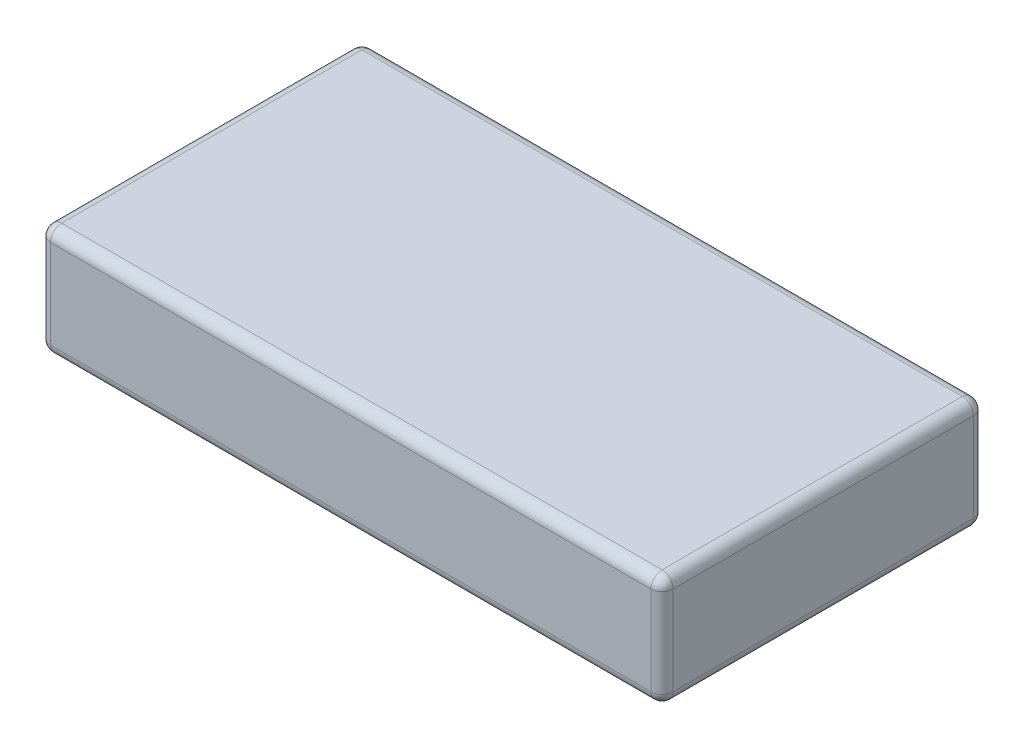
ISO-10303-21;
HEADER;
FILE_DESCRIPTION(('STEP AP214'),'2;1');
FILE_NAME('part.step','',(''),(''),'','','');
FILE_SCHEMA(('AUTOMOTIVE_DESIGN { 1 0 10303 214 1 1 1 1 }'));
ENDSEC;
DATA;
#1=APPLICATION_CONTEXT('core data for automotive mechanical design processes');
#2=APPLICATION_PROTOCOL_DEFINITION('international standard','automotive_design',2000,#1);
#3=PRODUCT_CONTEXT('',#1,'mechanical');
#4=PRODUCT('Part','Part','',(#3));
#5=PRODUCT_RELATED_PRODUCT_CATEGORY('part','',(#4));
#6=PRODUCT_DEFINITION_FORMATION('','',#4);
#7=PRODUCT_DEFINITION_CONTEXT('part definition',#1,'design');
#8=PRODUCT_DEFINITION('design','',#6,#7);
#9=PRODUCT_DEFINITION_SHAPE('','',#8);
#10=(LENGTH_UNIT() NAMED_UNIT(*) SI_UNIT(.MILLI.,.METRE.));
#11=(NAMED_UNIT(*) PLANE_ANGLE_UNIT() SI_UNIT($,.RADIAN.));
#12=(NAMED_UNIT(*) SI_UNIT($,.STERADIAN.) SOLID_ANGLE_UNIT());
#13=UNCERTAINTY_MEASURE_WITH_UNIT(LENGTH_MEASURE(1.E-05),#10,'distance_accuracy_value','');
#14=(GEOMETRIC_REPRESENTATION_CONTEXT(3) GLOBAL_UNCERTAINTY_ASSIGNED_CONTEXT((#13)) GLOBAL_UNIT_ASSIGNED_CONTEXT((#10,
#11,#12)) REPRESENTATION_CONTEXT('',''));
#15=CARTESIAN_POINT('',(0.,0.,0.));
#16=DIRECTION('',(0.,0.,1.));
#17=DIRECTION('',(1.,0.,0.));
#18=AXIS2_PLACEMENT_3D('',#15,#16,#17);
#19=CARTESIAN_POINT('',(28.,10.,-14.5));
#20=DIRECTION('',(-1.,0.,0.));
#21=DIRECTION('',(0.,0.,1.));
#22=AXIS2_PLACEMENT_3D('',#19,#20,#21);
#23=PLANE('',#22);
#24=DIRECTION('',(0.,-1.,0.));
#25=VECTOR('',#24,1.);
#26=CARTESIAN_POINT('',(28.,10.,13.5));
#27=LINE('',#26,#25);
#28=CARTESIAN_POINT('',(28.,9.,13.5));
#29=VERTEX_POINT('',#28);
#30=CARTESIAN_POINT('',(28.,0.999999999999999,13.5));
#31=VERTEX_POINT('',#30);
#32=EDGE_CURVE('E176',#29,#31,#27,.T.);
#33=ORIENTED_EDGE('',*,*,#32,.T.);
#34=DIRECTION('',(0.,0.,-1.));
#35=VECTOR('',#34,1.);
#36=CARTESIAN_POINT('',(28.,0.999999999999999,-14.5));
#37=LINE('',#36,#35);
#38=CARTESIAN_POINT('',(28.,0.999999999999999,-13.5));
#39=VERTEX_POINT('',#38);
#40=EDGE_CURVE('E181',#31,#39,#37,.T.);
#41=ORIENTED_EDGE('',*,*,#40,.T.);
#42=DIRECTION('',(0.,-1.,0.));
#43=VECTOR('',#42,1.);
#44=CARTESIAN_POINT('',(28.,10.,-13.5));
#45=LINE('',#44,#43);
#46=CARTESIAN_POINT('',(28.,9.,-13.5));
#47=VERTEX_POINT('',#46);
#48=EDGE_CURVE('E178',#39,#47,#45,.F.);
#49=ORIENTED_EDGE('',*,*,#48,.T.);
#50=DIRECTION('',(0.,0.,-1.));
#51=VECTOR('',#50,1.);
#52=CARTESIAN_POINT('',(28.,9.,14.5));
#53=LINE('',#52,#51);
#54=EDGE_CURVE('E174',#47,#29,#53,.F.);
#55=ORIENTED_EDGE('',*,*,#54,.T.);
#56=EDGE_LOOP('',(#33,#41,#49,#55));
#57=FACE_BOUND('',#56,.T.);
#58=ADVANCED_FACE('F34',(#57),#23,.F.);
#59=CARTESIAN_POINT('',(-28.,10.,-14.5));
#60=DIRECTION('',(0.,0.,1.));
#61=DIRECTION('',(1.,0.,0.));
#62=AXIS2_PLACEMENT_3D('',#59,#60,#61);
#63=PLANE('',#62);
#64=DIRECTION('',(0.,-1.,0.));
#65=VECTOR('',#64,1.);
#66=CARTESIAN_POINT('',(27.,10.,-14.5));
#67=LINE('',#66,#65);
#68=CARTESIAN_POINT('',(27.,9.,-14.5));
#69=VERTEX_POINT('',#68);
#70=CARTESIAN_POINT('',(27.,0.999999999999999,-14.5));
#71=VERTEX_POINT('',#70);
#72=EDGE_CURVE('E167',#69,#71,#67,.T.);
#73=ORIENTED_EDGE('',*,*,#72,.T.);
#74=DIRECTION('',(-1.,0.,0.));
#75=VECTOR('',#74,1.);
#76=CARTESIAN_POINT('',(-28.,0.999999999999999,-14.5));
#77=LINE('',#76,#75);
#78=CARTESIAN_POINT('',(-27.,0.999999999999999,-14.5));
#79=VERTEX_POINT('',#78);
#80=EDGE_CURVE('E172',#71,#79,#77,.T.);
#81=ORIENTED_EDGE('',*,*,#80,.T.);
#82=DIRECTION('',(0.,-1.,0.));
#83=VECTOR('',#82,1.);
#84=CARTESIAN_POINT('',(-27.,10.,-14.5));
#85=LINE('',#84,#83);
#86=CARTESIAN_POINT('',(-27.,9.,-14.5));
#87=VERTEX_POINT('',#86);
#88=EDGE_CURVE('E169',#79,#87,#85,.F.);
#89=ORIENTED_EDGE('',*,*,#88,.T.);
#90=DIRECTION('',(-1.,0.,0.));
#91=VECTOR('',#90,1.);
#92=CARTESIAN_POINT('',(28.,9.,-14.5));
#93=LINE('',#92,#91);
#94=EDGE_CURVE('E165',#87,#69,#93,.F.);
#95=ORIENTED_EDGE('',*,*,#94,.T.);
#96=EDGE_LOOP('',(#73,#81,#89,#95));
#97=FACE_BOUND('',#96,.T.);
#98=ADVANCED_FACE('F305',(#97),#63,.F.);
#99=CARTESIAN_POINT('',(-28.,10.,-14.5));
#100=DIRECTION('',(1.,0.,0.));
#101=DIRECTION('',(0.,0.,-1.));
#102=AXIS2_PLACEMENT_3D('',#99,#100,#101);
#103=PLANE('',#102);
#104=DIRECTION('',(0.,-1.,0.));
#105=VECTOR('',#104,1.);
#106=CARTESIAN_POINT('',(-28.,10.,-13.5));
#107=LINE('',#106,#105);
#108=CARTESIAN_POINT('',(-28.,9.,-13.5));
#109=VERTEX_POINT('',#108);
#110=CARTESIAN_POINT('',(-28.,0.999999999999999,-13.5));
#111=VERTEX_POINT('',#110);
#112=EDGE_CURVE('E133',#109,#111,#107,.T.);
#113=ORIENTED_EDGE('',*,*,#112,.T.);
#114=DIRECTION('',(0.,0.,1.));
#115=VECTOR('',#114,1.);
#116=CARTESIAN_POINT('',(-28.,0.999999999999999,-14.5));
#117=LINE('',#116,#115);
#118=CARTESIAN_POINT('',(-28.,0.999999999999999,13.5));
#119=VERTEX_POINT('',#118);
#120=EDGE_CURVE('E129',#111,#119,#117,.T.);
#121=ORIENTED_EDGE('',*,*,#120,.T.);
#122=DIRECTION('',(0.,-1.,0.));
#123=VECTOR('',#122,1.);
#124=CARTESIAN_POINT('',(-28.,10.,13.5));
#125=LINE('',#124,#123);
#126=CARTESIAN_POINT('',(-28.,9.,13.5));
#127=VERTEX_POINT('',#126);
#128=EDGE_CURVE('E121',#119,#127,#125,.F.);
#129=ORIENTED_EDGE('',*,*,#128,.T.);
#130=DIRECTION('',(0.,0.,1.));
#131=VECTOR('',#130,1.);
#132=CARTESIAN_POINT('',(-28.,9.,-14.5));
#133=LINE('',#132,#131);
#134=EDGE_CURVE('E126',#127,#109,#133,.F.);
#135=ORIENTED_EDGE('',*,*,#134,.T.);
#136=EDGE_LOOP('',(#113,#121,#129,#135));
#137=FACE_BOUND('',#136,.T.);
#138=ADVANCED_FACE('F124',(#137),#103,.F.);
#139=CARTESIAN_POINT('',(-28.,10.,14.5));
#140=DIRECTION('',(0.,0.,-1.));
#141=DIRECTION('',(-1.,0.,0.));
#142=AXIS2_PLACEMENT_3D('',#139,#140,#141);
#143=PLANE('',#142);
#144=DIRECTION('',(0.,-1.,0.));
#145=VECTOR('',#144,1.);
#146=CARTESIAN_POINT('',(-27.,10.,14.5));
#147=LINE('',#146,#145);
#148=CARTESIAN_POINT('',(-27.,9.,14.5));
#149=VERTEX_POINT('',#148);
#150=CARTESIAN_POINT('',(-27.,0.999999999999999,14.5));
#151=VERTEX_POINT('',#150);
#152=EDGE_CURVE('E141',#149,#151,#147,.T.);
#153=ORIENTED_EDGE('',*,*,#152,.T.);
#154=DIRECTION('',(1.,0.,0.));
#155=VECTOR('',#154,1.);
#156=CARTESIAN_POINT('',(-28.,0.999999999999999,14.5));
#157=LINE('',#156,#155);
#158=CARTESIAN_POINT('',(27.,0.999999999999999,14.5));
#159=VERTEX_POINT('',#158);
#160=EDGE_CURVE('E188',#151,#159,#157,.T.);
#161=ORIENTED_EDGE('',*,*,#160,.T.);
#162=DIRECTION('',(0.,-1.,0.));
#163=VECTOR('',#162,1.);
#164=CARTESIAN_POINT('',(27.,10.,14.5));
#165=LINE('',#164,#163);
#166=CARTESIAN_POINT('',(27.,9.,14.5));
#167=VERTEX_POINT('',#166);
#168=EDGE_CURVE('E185',#159,#167,#165,.F.);
#169=ORIENTED_EDGE('',*,*,#168,.T.);
#170=DIRECTION('',(1.,0.,0.));
#171=VECTOR('',#170,1.);
#172=CARTESIAN_POINT('',(-28.,9.,14.5));
#173=LINE('',#172,#171);
#174=EDGE_CURVE('E183',#167,#149,#173,.F.);
#175=ORIENTED_EDGE('',*,*,#174,.T.);
#176=EDGE_LOOP('',(#153,#161,#169,#175));
#177=FACE_BOUND('',#176,.T.);
#178=ADVANCED_FACE('F296',(#177),#143,.F.);
#179=CARTESIAN_POINT('',(0.,10.,0.));
#180=DIRECTION('',(0.,1.,0.));
#181=DIRECTION('',(0.,0.,1.));
#182=AXIS2_PLACEMENT_3D('',#179,#180,#181);
#183=PLANE('',#182);
#184=DIRECTION('',(0.,0.,1.));
#185=VECTOR('',#184,1.);
#186=CARTESIAN_POINT('',(-27.,10.,14.5));
#187=LINE('',#186,#185);
#188=CARTESIAN_POINT('',(-27.,10.,-13.5));
#189=VERTEX_POINT('',#188);
#190=CARTESIAN_POINT('',(-27.,10.,13.5));
#191=VERTEX_POINT('',#190);
#192=EDGE_CURVE('E43',#189,#191,#187,.T.);
#193=ORIENTED_EDGE('',*,*,#192,.T.);
#194=DIRECTION('',(1.,0.,0.));
#195=VECTOR('',#194,1.);
#196=CARTESIAN_POINT('',(28.,10.,13.5));
#197=LINE('',#196,#195);
#198=CARTESIAN_POINT('',(27.,10.,13.5));
#199=VERTEX_POINT('',#198);
#200=EDGE_CURVE('E11',#191,#199,#197,.T.);
#201=ORIENTED_EDGE('',*,*,#200,.T.);
#202=DIRECTION('',(0.,0.,-1.));
#203=VECTOR('',#202,1.);
#204=CARTESIAN_POINT('',(27.,10.,-14.5));
#205=LINE('',#204,#203);
#206=CARTESIAN_POINT('',(27.,10.,-13.5));
#207=VERTEX_POINT('',#206);
#208=EDGE_CURVE('E199',#199,#207,#205,.T.);
#209=ORIENTED_EDGE('',*,*,#208,.T.);
#210=DIRECTION('',(-1.,0.,0.));
#211=VECTOR('',#210,1.);
#212=CARTESIAN_POINT('',(-28.,10.,-13.5));
#213=LINE('',#212,#211);
#214=EDGE_CURVE('E54',#207,#189,#213,.T.);
#215=ORIENTED_EDGE('',*,*,#214,.T.);
#216=EDGE_LOOP('',(#193,#201,#209,#215));
#217=FACE_BOUND('',#216,.T.);
#218=ADVANCED_FACE('F298',(#217),#183,.T.);
#219=CARTESIAN_POINT('',(0.,0.,0.));
#220=DIRECTION('',(0.,1.,0.));
#221=DIRECTION('',(0.,0.,1.));
#222=AXIS2_PLACEMENT_3D('',#219,#220,#221);
#223=PLANE('',#222);
#224=DIRECTION('',(0.,0.,1.));
#225=VECTOR('',#224,1.);
#226=CARTESIAN_POINT('',(-27.,0.,0.));
#227=LINE('',#226,#225);
#228=CARTESIAN_POINT('',(-27.,0.,13.5));
#229=VERTEX_POINT('',#228);
#230=CARTESIAN_POINT('',(-27.,0.,-13.5));
#231=VERTEX_POINT('',#230);
#232=EDGE_CURVE('E194',#229,#231,#227,.F.);
#233=ORIENTED_EDGE('',*,*,#232,.T.);
#234=DIRECTION('',(-1.,0.,0.));
#235=VECTOR('',#234,1.);
#236=CARTESIAN_POINT('',(0.,0.,-13.5));
#237=LINE('',#236,#235);
#238=CARTESIAN_POINT('',(27.,0.,-13.5));
#239=VERTEX_POINT('',#238);
#240=EDGE_CURVE('E196',#231,#239,#237,.F.);
#241=ORIENTED_EDGE('',*,*,#240,.T.);
#242=DIRECTION('',(0.,0.,-1.));
#243=VECTOR('',#242,1.);
#244=CARTESIAN_POINT('',(27.,0.,0.));
#245=LINE('',#244,#243);
#246=CARTESIAN_POINT('',(27.,0.,13.5));
#247=VERTEX_POINT('',#246);
#248=EDGE_CURVE('E190',#239,#247,#245,.F.);
#249=ORIENTED_EDGE('',*,*,#248,.T.);
#250=DIRECTION('',(1.,0.,0.));
#251=VECTOR('',#250,1.);
#252=CARTESIAN_POINT('',(0.,0.,13.5));
#253=LINE('',#252,#251);
#254=EDGE_CURVE('E192',#247,#229,#253,.F.);
#255=ORIENTED_EDGE('',*,*,#254,.T.);
#256=EDGE_LOOP('',(#233,#241,#249,#255));
#257=FACE_BOUND('',#256,.T.);
#258=ADVANCED_FACE('F266',(#257),#223,.F.);
#259=CARTESIAN_POINT('',(27.,10.,13.5));
#260=DIRECTION('',(0.,-1.,0.));
#261=DIRECTION('',(0.,0.,-1.));
#262=AXIS2_PLACEMENT_3D('',#259,#260,#261);
#263=CYLINDRICAL_SURFACE('',#262,1.);
#264=CARTESIAN_POINT('',(27.,9.,13.5));
#265=DIRECTION('',(0.,1.,0.));
#266=DIRECTION('',(0.,0.,1.));
#267=AXIS2_PLACEMENT_3D('',#264,#265,#266);
#268=CIRCLE('',#267,1.);
#269=EDGE_CURVE('E38',#167,#29,#268,.T.);
#270=ORIENTED_EDGE('',*,*,#269,.F.);
#271=ORIENTED_EDGE('',*,*,#168,.F.);
#272=CARTESIAN_POINT('',(27.,0.999999999999999,13.5));
#273=DIRECTION('',(0.,-1.,0.));
#274=DIRECTION('',(0.,0.,-1.));
#275=AXIS2_PLACEMENT_3D('',#272,#273,#274);
#276=CIRCLE('',#275,1.);
#277=EDGE_CURVE('E161',#31,#159,#276,.T.);
#278=ORIENTED_EDGE('',*,*,#277,.F.);
#279=ORIENTED_EDGE('',*,*,#32,.F.);
#280=EDGE_LOOP('',(#270,#271,#278,#279));
#281=FACE_BOUND('',#280,.T.);
#282=ADVANCED_FACE('F36',(#281),#263,.T.);
#283=CARTESIAN_POINT('',(27.,9.,13.5));
#284=DIRECTION('',(0.,0.,1.));
#285=DIRECTION('',(1.,0.,0.));
#286=AXIS2_PLACEMENT_3D('',#283,#284,#285);
#287=SPHERICAL_SURFACE('',#286,1.);
#288=CARTESIAN_POINT('',(27.,9.,13.5));
#289=DIRECTION('',(1.,0.,0.));
#290=DIRECTION('',(0.,0.,-1.));
#291=AXIS2_PLACEMENT_3D('',#288,#289,#290);
#292=CIRCLE('',#291,1.);
#293=EDGE_CURVE('E244',#167,#199,#292,.F.);
#294=ORIENTED_EDGE('',*,*,#293,.F.);
#295=ORIENTED_EDGE('',*,*,#269,.T.);
#296=CARTESIAN_POINT('',(27.,9.,13.5));
#297=DIRECTION('',(0.,0.,1.));
#298=DIRECTION('',(0.,-1.,0.));
#299=AXIS2_PLACEMENT_3D('',#296,#297,#298);
#300=CIRCLE('',#299,1.);
#301=EDGE_CURVE('E247',#199,#29,#300,.F.);
#302=ORIENTED_EDGE('',*,*,#301,.F.);
#303=EDGE_LOOP('',(#294,#295,#302));
#304=FACE_BOUND('',#303,.T.);
#305=ADVANCED_FACE('F291',(#304),#287,.T.);
#306=CARTESIAN_POINT('',(27.,1.,13.5));
#307=DIRECTION('',(0.,0.,1.));
#308=DIRECTION('',(1.,0.,0.));
#309=AXIS2_PLACEMENT_3D('',#306,#307,#308);
#310=SPHERICAL_SURFACE('',#309,1.);
#311=CARTESIAN_POINT('',(27.,1.,13.5));
#312=DIRECTION('',(0.,0.,1.));
#313=DIRECTION('',(1.,0.,0.));
#314=AXIS2_PLACEMENT_3D('',#311,#312,#313);
#315=CIRCLE('',#314,1.);
#316=EDGE_CURVE('E238',#31,#247,#315,.F.);
#317=ORIENTED_EDGE('',*,*,#316,.F.);
#318=ORIENTED_EDGE('',*,*,#277,.T.);
#319=CARTESIAN_POINT('',(27.,0.999999999999999,13.5));
#320=DIRECTION('',(1.,0.,0.));
#321=DIRECTION('',(0.,0.,-1.));
#322=AXIS2_PLACEMENT_3D('',#319,#320,#321);
#323=CIRCLE('',#322,1.);
#324=EDGE_CURVE('E241',#247,#159,#323,.F.);
#325=ORIENTED_EDGE('',*,*,#324,.F.);
#326=EDGE_LOOP('',(#317,#318,#325));
#327=FACE_BOUND('',#326,.T.);
#328=ADVANCED_FACE('F254',(#327),#310,.T.);
#329=CARTESIAN_POINT('',(27.,9.,0.));
#330=DIRECTION('',(0.,0.,1.));
#331=DIRECTION('',(1.,0.,0.));
#332=AXIS2_PLACEMENT_3D('',#329,#330,#331);
#333=CYLINDRICAL_SURFACE('',#332,1.);
#334=ORIENTED_EDGE('',*,*,#301,.T.);
#335=ORIENTED_EDGE('',*,*,#54,.F.);
#336=CARTESIAN_POINT('',(27.,9.,-13.5));
#337=DIRECTION('',(0.,0.,-1.));
#338=DIRECTION('',(-1.,0.,0.));
#339=AXIS2_PLACEMENT_3D('',#336,#337,#338);
#340=CIRCLE('',#339,1.);
#341=EDGE_CURVE('E233',#207,#47,#340,.T.);
#342=ORIENTED_EDGE('',*,*,#341,.F.);
#343=ORIENTED_EDGE('',*,*,#208,.F.);
#344=EDGE_LOOP('',(#334,#335,#342,#343));
#345=FACE_BOUND('',#344,.T.);
#346=ADVANCED_FACE('F286',(#345),#333,.T.);
#347=CARTESIAN_POINT('',(0.,9.,13.5));
#348=DIRECTION('',(-1.,0.,0.));
#349=DIRECTION('',(0.,0.,1.));
#350=AXIS2_PLACEMENT_3D('',#347,#348,#349);
#351=CYLINDRICAL_SURFACE('',#350,1.);
#352=ORIENTED_EDGE('',*,*,#293,.T.);
#353=ORIENTED_EDGE('',*,*,#200,.F.);
#354=CARTESIAN_POINT('',(-27.,9.,13.5));
#355=DIRECTION('',(-1.,0.,0.));
#356=DIRECTION('',(0.,0.,1.));
#357=AXIS2_PLACEMENT_3D('',#354,#355,#356);
#358=CIRCLE('',#357,1.);
#359=EDGE_CURVE('E145',#149,#191,#358,.T.);
#360=ORIENTED_EDGE('',*,*,#359,.F.);
#361=ORIENTED_EDGE('',*,*,#174,.F.);
#362=EDGE_LOOP('',(#352,#353,#360,#361));
#363=FACE_BOUND('',#362,.T.);
#364=ADVANCED_FACE('F294',(#363),#351,.T.);
#365=CARTESIAN_POINT('',(-27.,10.,13.5));
#366=DIRECTION('',(0.,-1.,0.));
#367=DIRECTION('',(0.,0.,-1.));
#368=AXIS2_PLACEMENT_3D('',#365,#366,#367);
#369=CYLINDRICAL_SURFACE('',#368,1.);
#370=CARTESIAN_POINT('',(-27.,0.999999999999999,13.5));
#371=DIRECTION('',(0.,-1.,0.));
#372=DIRECTION('',(0.,0.,-1.));
#373=AXIS2_PLACEMENT_3D('',#370,#371,#372);
#374=CIRCLE('',#373,1.);
#375=EDGE_CURVE('E146',#151,#119,#374,.T.);
#376=ORIENTED_EDGE('',*,*,#375,.F.);
#377=ORIENTED_EDGE('',*,*,#152,.F.);
#378=CARTESIAN_POINT('',(-27.,9.,13.5));
#379=DIRECTION('',(0.,1.,0.));
#380=DIRECTION('',(0.,0.,1.));
#381=AXIS2_PLACEMENT_3D('',#378,#379,#380);
#382=CIRCLE('',#381,1.);
#383=EDGE_CURVE('E137',#127,#149,#382,.T.);
#384=ORIENTED_EDGE('',*,*,#383,.F.);
#385=ORIENTED_EDGE('',*,*,#128,.F.);
#386=EDGE_LOOP('',(#376,#377,#384,#385));
#387=FACE_BOUND('',#386,.T.);
#388=ADVANCED_FACE('F139',(#387),#369,.T.);
#389=CARTESIAN_POINT('',(-28.,0.999999999999999,13.5));
#390=DIRECTION('',(1.,0.,0.));
#391=DIRECTION('',(0.,0.,-1.));
#392=AXIS2_PLACEMENT_3D('',#389,#390,#391);
#393=CYLINDRICAL_SURFACE('',#392,1.);
#394=ORIENTED_EDGE('',*,*,#324,.T.);
#395=ORIENTED_EDGE('',*,*,#160,.F.);
#396=CARTESIAN_POINT('',(-27.,1.,13.5));
#397=DIRECTION('',(-1.,0.,0.));
#398=DIRECTION('',(0.,0.,1.));
#399=AXIS2_PLACEMENT_3D('',#396,#397,#398);
#400=CIRCLE('',#399,1.);
#401=EDGE_CURVE('E229',#229,#151,#400,.T.);
#402=ORIENTED_EDGE('',*,*,#401,.F.);
#403=ORIENTED_EDGE('',*,*,#254,.F.);
#404=EDGE_LOOP('',(#394,#395,#402,#403));
#405=FACE_BOUND('',#404,.T.);
#406=ADVANCED_FACE('F262',(#405),#393,.T.);
#407=CARTESIAN_POINT('',(27.,0.999999999999999,-14.5));
#408=DIRECTION('',(0.,0.,-1.));
#409=DIRECTION('',(-1.,0.,0.));
#410=AXIS2_PLACEMENT_3D('',#407,#408,#409);
#411=CYLINDRICAL_SURFACE('',#410,1.);
#412=ORIENTED_EDGE('',*,*,#316,.T.);
#413=ORIENTED_EDGE('',*,*,#248,.F.);
#414=CARTESIAN_POINT('',(27.,0.999999999999999,-13.5));
#415=DIRECTION('',(0.,0.,-1.));
#416=DIRECTION('',(-1.,0.,0.));
#417=AXIS2_PLACEMENT_3D('',#414,#415,#416);
#418=CIRCLE('',#417,1.);
#419=EDGE_CURVE('E226',#39,#239,#418,.T.);
#420=ORIENTED_EDGE('',*,*,#419,.F.);
#421=ORIENTED_EDGE('',*,*,#40,.F.);
#422=EDGE_LOOP('',(#412,#413,#420,#421));
#423=FACE_BOUND('',#422,.T.);
#424=ADVANCED_FACE('F272',(#423),#411,.T.);
#425=CARTESIAN_POINT('',(27.,10.,-13.5));
#426=DIRECTION('',(0.,-1.,0.));
#427=DIRECTION('',(0.,0.,-1.));
#428=AXIS2_PLACEMENT_3D('',#425,#426,#427);
#429=CYLINDRICAL_SURFACE('',#428,1.);
#430=CARTESIAN_POINT('',(27.,9.,-13.5));
#431=DIRECTION('',(0.,1.,0.));
#432=DIRECTION('',(0.,0.,1.));
#433=AXIS2_PLACEMENT_3D('',#430,#431,#432);
#434=CIRCLE('',#433,1.);
#435=EDGE_CURVE('E235',#47,#69,#434,.T.);
#436=ORIENTED_EDGE('',*,*,#435,.F.);
#437=ORIENTED_EDGE('',*,*,#48,.F.);
#438=CARTESIAN_POINT('',(27.,0.999999999999999,-13.5));
#439=DIRECTION('',(0.,-1.,0.));
#440=DIRECTION('',(0.,0.,-1.));
#441=AXIS2_PLACEMENT_3D('',#438,#439,#440);
#442=CIRCLE('',#441,1.);
#443=EDGE_CURVE('E223',#71,#39,#442,.T.);
#444=ORIENTED_EDGE('',*,*,#443,.F.);
#445=ORIENTED_EDGE('',*,*,#72,.F.);
#446=EDGE_LOOP('',(#436,#437,#444,#445));
#447=FACE_BOUND('',#446,.T.);
#448=ADVANCED_FACE('F278',(#447),#429,.T.);
#449=CARTESIAN_POINT('',(27.,9.,-13.5));
#450=DIRECTION('',(0.,0.,1.));
#451=DIRECTION('',(1.,0.,0.));
#452=AXIS2_PLACEMENT_3D('',#449,#450,#451);
#453=SPHERICAL_SURFACE('',#452,1.);
#454=ORIENTED_EDGE('',*,*,#341,.T.);
#455=ORIENTED_EDGE('',*,*,#435,.T.);
#456=CARTESIAN_POINT('',(27.,9.,-13.5));
#457=DIRECTION('',(1.,0.,0.));
#458=DIRECTION('',(0.,0.,-1.));
#459=AXIS2_PLACEMENT_3D('',#456,#457,#458);
#460=CIRCLE('',#459,1.);
#461=EDGE_CURVE('E152',#207,#69,#460,.F.);
#462=ORIENTED_EDGE('',*,*,#461,.F.);
#463=EDGE_LOOP('',(#454,#455,#462));
#464=FACE_BOUND('',#463,.T.);
#465=ADVANCED_FACE('F352',(#464),#453,.T.);
#466=CARTESIAN_POINT('',(-27.,9.,13.5));
#467=DIRECTION('',(0.,0.,1.));
#468=DIRECTION('',(1.,0.,0.));
#469=AXIS2_PLACEMENT_3D('',#466,#467,#468);
#470=SPHERICAL_SURFACE('',#469,1.);
#471=ORIENTED_EDGE('',*,*,#383,.T.);
#472=ORIENTED_EDGE('',*,*,#359,.T.);
#473=CARTESIAN_POINT('',(-27.,9.,13.5));
#474=DIRECTION('',(0.,0.,1.));
#475=DIRECTION('',(1.,0.,0.));
#476=AXIS2_PLACEMENT_3D('',#473,#474,#475);
#477=CIRCLE('',#476,1.);
#478=EDGE_CURVE('E149',#127,#191,#477,.F.);
#479=ORIENTED_EDGE('',*,*,#478,.F.);
#480=EDGE_LOOP('',(#471,#472,#479));
#481=FACE_BOUND('',#480,.T.);
#482=ADVANCED_FACE('F150',(#481),#470,.T.);
#483=CARTESIAN_POINT('',(-27.,1.,13.5));
#484=DIRECTION('',(0.,0.,1.));
#485=DIRECTION('',(1.,0.,0.));
#486=AXIS2_PLACEMENT_3D('',#483,#484,#485);
#487=SPHERICAL_SURFACE('',#486,1.);
#488=ORIENTED_EDGE('',*,*,#401,.T.);
#489=ORIENTED_EDGE('',*,*,#375,.T.);
#490=CARTESIAN_POINT('',(-27.,0.999999999999999,13.5));
#491=DIRECTION('',(0.,0.,1.));
#492=DIRECTION('',(1.,0.,0.));
#493=AXIS2_PLACEMENT_3D('',#490,#491,#492);
#494=CIRCLE('',#493,1.);
#495=EDGE_CURVE('E153',#229,#119,#494,.F.);
#496=ORIENTED_EDGE('',*,*,#495,.F.);
#497=EDGE_LOOP('',(#488,#489,#496));
#498=FACE_BOUND('',#497,.T.);
#499=ADVANCED_FACE('F345',(#498),#487,.T.);
#500=CARTESIAN_POINT('',(27.,1.,-13.5));
#501=DIRECTION('',(0.,0.,1.));
#502=DIRECTION('',(1.,0.,0.));
#503=AXIS2_PLACEMENT_3D('',#500,#501,#502);
#504=SPHERICAL_SURFACE('',#503,1.);
#505=ORIENTED_EDGE('',*,*,#443,.T.);
#506=ORIENTED_EDGE('',*,*,#419,.T.);
#507=CARTESIAN_POINT('',(27.,1.,-13.5));
#508=DIRECTION('',(1.,0.,0.));
#509=DIRECTION('',(0.,0.,-1.));
#510=AXIS2_PLACEMENT_3D('',#507,#508,#509);
#511=CIRCLE('',#510,1.);
#512=EDGE_CURVE('E217',#71,#239,#511,.F.);
#513=ORIENTED_EDGE('',*,*,#512,.F.);
#514=EDGE_LOOP('',(#505,#506,#513));
#515=FACE_BOUND('',#514,.T.);
#516=ADVANCED_FACE('F341',(#515),#504,.T.);
#517=CARTESIAN_POINT('',(0.,9.,-13.5));
#518=DIRECTION('',(1.,0.,0.));
#519=DIRECTION('',(0.,0.,-1.));
#520=AXIS2_PLACEMENT_3D('',#517,#518,#519);
#521=CYLINDRICAL_SURFACE('',#520,1.);
#522=ORIENTED_EDGE('',*,*,#461,.T.);
#523=ORIENTED_EDGE('',*,*,#94,.F.);
#524=CARTESIAN_POINT('',(-27.,9.,-13.5));
#525=DIRECTION('',(-1.,0.,0.));
#526=DIRECTION('',(0.,0.,1.));
#527=AXIS2_PLACEMENT_3D('',#524,#525,#526);
#528=CIRCLE('',#527,1.);
#529=EDGE_CURVE('E214',#189,#87,#528,.T.);
#530=ORIENTED_EDGE('',*,*,#529,.F.);
#531=ORIENTED_EDGE('',*,*,#214,.F.);
#532=EDGE_LOOP('',(#522,#523,#530,#531));
#533=FACE_BOUND('',#532,.T.);
#534=ADVANCED_FACE('F338',(#533),#521,.T.);
#535=CARTESIAN_POINT('',(-27.,9.,0.));
#536=DIRECTION('',(0.,0.,-1.));
#537=DIRECTION('',(-1.,0.,0.));
#538=AXIS2_PLACEMENT_3D('',#535,#536,#537);
#539=CYLINDRICAL_SURFACE('',#538,1.);
#540=ORIENTED_EDGE('',*,*,#478,.T.);
#541=ORIENTED_EDGE('',*,*,#192,.F.);
#542=CARTESIAN_POINT('',(-27.,9.,-13.5));
#543=DIRECTION('',(0.,0.,-1.));
#544=DIRECTION('',(-1.,0.,0.));
#545=AXIS2_PLACEMENT_3D('',#542,#543,#544);
#546=CIRCLE('',#545,1.);
#547=EDGE_CURVE('E157',#109,#189,#546,.T.);
#548=ORIENTED_EDGE('',*,*,#547,.F.);
#549=ORIENTED_EDGE('',*,*,#134,.F.);
#550=EDGE_LOOP('',(#540,#541,#548,#549));
#551=FACE_BOUND('',#550,.T.);
#552=ADVANCED_FACE('F155',(#551),#539,.T.);
#553=CARTESIAN_POINT('',(-27.,0.999999999999999,-14.5));
#554=DIRECTION('',(0.,0.,1.));
#555=DIRECTION('',(1.,0.,0.));
#556=AXIS2_PLACEMENT_3D('',#553,#554,#555);
#557=CYLINDRICAL_SURFACE('',#556,1.);
#558=ORIENTED_EDGE('',*,*,#495,.T.);
#559=ORIENTED_EDGE('',*,*,#120,.F.);
#560=CARTESIAN_POINT('',(-27.,1.,-13.5));
#561=DIRECTION('',(0.,0.,-1.));
#562=DIRECTION('',(-1.,0.,0.));
#563=AXIS2_PLACEMENT_3D('',#560,#561,#562);
#564=CIRCLE('',#563,1.);
#565=EDGE_CURVE('E210',#231,#111,#564,.T.);
#566=ORIENTED_EDGE('',*,*,#565,.F.);
#567=ORIENTED_EDGE('',*,*,#232,.F.);
#568=EDGE_LOOP('',(#558,#559,#566,#567));
#569=FACE_BOUND('',#568,.T.);
#570=ADVANCED_FACE('F331',(#569),#557,.T.);
#571=CARTESIAN_POINT('',(-28.,0.999999999999999,-13.5));
#572=DIRECTION('',(-1.,0.,0.));
#573=DIRECTION('',(0.,0.,1.));
#574=AXIS2_PLACEMENT_3D('',#571,#572,#573);
#575=CYLINDRICAL_SURFACE('',#574,1.);
#576=ORIENTED_EDGE('',*,*,#512,.T.);
#577=ORIENTED_EDGE('',*,*,#240,.F.);
#578=CARTESIAN_POINT('',(-27.,0.999999999999999,-13.5));
#579=DIRECTION('',(-1.,0.,0.));
#580=DIRECTION('',(0.,0.,1.));
#581=AXIS2_PLACEMENT_3D('',#578,#579,#580);
#582=CIRCLE('',#581,1.);
#583=EDGE_CURVE('E207',#79,#231,#582,.T.);
#584=ORIENTED_EDGE('',*,*,#583,.F.);
#585=ORIENTED_EDGE('',*,*,#80,.F.);
#586=EDGE_LOOP('',(#576,#577,#584,#585));
#587=FACE_BOUND('',#586,.T.);
#588=ADVANCED_FACE('F327',(#587),#575,.T.);
#589=CARTESIAN_POINT('',(-27.,9.,-13.5));
#590=DIRECTION('',(0.,0.,1.));
#591=DIRECTION('',(1.,0.,0.));
#592=AXIS2_PLACEMENT_3D('',#589,#590,#591);
#593=SPHERICAL_SURFACE('',#592,1.);
#594=ORIENTED_EDGE('',*,*,#547,.T.);
#595=ORIENTED_EDGE('',*,*,#529,.T.);
#596=CARTESIAN_POINT('',(-27.,9.,-13.5));
#597=DIRECTION('',(0.,1.,0.));
#598=DIRECTION('',(0.,0.,1.));
#599=AXIS2_PLACEMENT_3D('',#596,#597,#598);
#600=CIRCLE('',#599,1.);
#601=EDGE_CURVE('E205',#109,#87,#600,.F.);
#602=ORIENTED_EDGE('',*,*,#601,.F.);
#603=EDGE_LOOP('',(#594,#595,#602));
#604=FACE_BOUND('',#603,.T.);
#605=ADVANCED_FACE('F323',(#604),#593,.T.);
#606=CARTESIAN_POINT('',(-27.,1.,-13.5));
#607=DIRECTION('',(0.,0.,1.));
#608=DIRECTION('',(1.,0.,0.));
#609=AXIS2_PLACEMENT_3D('',#606,#607,#608);
#610=SPHERICAL_SURFACE('',#609,1.);
#611=ORIENTED_EDGE('',*,*,#583,.T.);
#612=ORIENTED_EDGE('',*,*,#565,.T.);
#613=CARTESIAN_POINT('',(-27.,0.999999999999999,-13.5));
#614=DIRECTION('',(0.,-1.,0.));
#615=DIRECTION('',(0.,0.,-1.));
#616=AXIS2_PLACEMENT_3D('',#613,#614,#615);
#617=CIRCLE('',#616,1.);
#618=EDGE_CURVE('E203',#79,#111,#617,.F.);
#619=ORIENTED_EDGE('',*,*,#618,.F.);
#620=EDGE_LOOP('',(#611,#612,#619));
#621=FACE_BOUND('',#620,.T.);
#622=ADVANCED_FACE('F319',(#621),#610,.T.);
#623=CARTESIAN_POINT('',(-27.,10.,-13.5));
#624=DIRECTION('',(0.,-1.,0.));
#625=DIRECTION('',(0.,0.,-1.));
#626=AXIS2_PLACEMENT_3D('',#623,#624,#625);
#627=CYLINDRICAL_SURFACE('',#626,1.);
#628=ORIENTED_EDGE('',*,*,#601,.T.);
#629=ORIENTED_EDGE('',*,*,#88,.F.);
#630=ORIENTED_EDGE('',*,*,#618,.T.);
#631=ORIENTED_EDGE('',*,*,#112,.F.);
#632=EDGE_LOOP('',(#628,#629,#630,#631));
#633=FACE_BOUND('',#632,.T.);
#634=ADVANCED_FACE('F316',(#633),#627,.T.);
#635=CLOSED_SHELL('',(#58,#98,#138,#178,#218,#258,#282,#305,#328,#346,#364,#388,#406,#424,#448,
#465,#482,#499,#516,#534,#552,#570,#588,#605,#622,#634));
#636=MANIFOLD_SOLID_BREP('B2',#635);
#637=ADVANCED_BREP_SHAPE_REPRESENTATION('',(#18,#636),#14);
#638=SHAPE_DEFINITION_REPRESENTATION(#9,#637);
ENDSEC;
END-ISO-10303-21;
